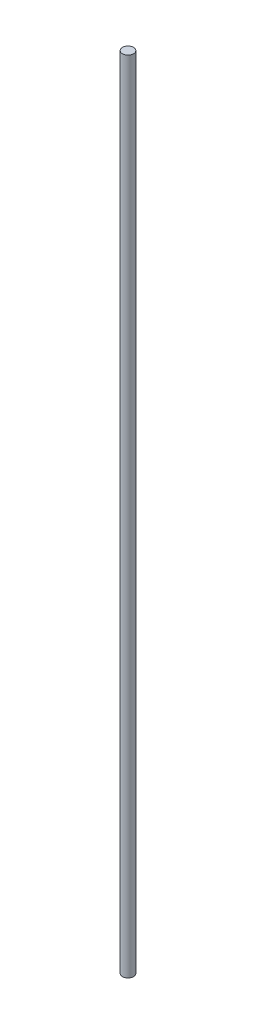
ISO-10303-21;
HEADER;
FILE_DESCRIPTION(('STEP AP214'),'2;1');
FILE_NAME('part.step','',(''),(''),'','','');
FILE_SCHEMA(('AUTOMOTIVE_DESIGN { 1 0 10303 214 1 1 1 1 }'));
ENDSEC;
DATA;
#1=APPLICATION_CONTEXT('core data for automotive mechanical design processes');
#2=APPLICATION_PROTOCOL_DEFINITION('international standard','automotive_design',2000,#1);
#3=PRODUCT_CONTEXT('',#1,'mechanical');
#4=PRODUCT('Part','Part','',(#3));
#5=PRODUCT_RELATED_PRODUCT_CATEGORY('part','',(#4));
#6=PRODUCT_DEFINITION_FORMATION('','',#4);
#7=PRODUCT_DEFINITION_CONTEXT('part definition',#1,'design');
#8=PRODUCT_DEFINITION('design','',#6,#7);
#9=PRODUCT_DEFINITION_SHAPE('','',#8);
#10=(LENGTH_UNIT() NAMED_UNIT(*) SI_UNIT(.MILLI.,.METRE.));
#11=(NAMED_UNIT(*) PLANE_ANGLE_UNIT() SI_UNIT($,.RADIAN.));
#12=(NAMED_UNIT(*) SI_UNIT($,.STERADIAN.) SOLID_ANGLE_UNIT());
#13=UNCERTAINTY_MEASURE_WITH_UNIT(LENGTH_MEASURE(1.E-05),#10,'distance_accuracy_value','');
#14=(GEOMETRIC_REPRESENTATION_CONTEXT(3) GLOBAL_UNCERTAINTY_ASSIGNED_CONTEXT((#13)) GLOBAL_UNIT_ASSIGNED_CONTEXT((#10,
#11,#12)) REPRESENTATION_CONTEXT('',''));
#15=CARTESIAN_POINT('',(0.,0.,0.));
#16=DIRECTION('',(0.,0.,1.));
#17=DIRECTION('',(1.,0.,0.));
#18=AXIS2_PLACEMENT_3D('',#15,#16,#17);
#19=CARTESIAN_POINT('',(0.,457.2,0.));
#20=DIRECTION('',(0.,-1.,0.));
#21=DIRECTION('',(0.,0.,-1.));
#22=AXIS2_PLACEMENT_3D('',#19,#20,#21);
#23=CYLINDRICAL_SURFACE('',#22,3.175);
#24=CARTESIAN_POINT('',(0.,457.2,0.));
#25=DIRECTION('',(0.,1.,0.));
#26=DIRECTION('',(0.,0.,1.));
#27=AXIS2_PLACEMENT_3D('',#24,#25,#26);
#28=CIRCLE('',#27,3.175);
#29=CARTESIAN_POINT('',(0.,457.2,3.175));
#30=VERTEX_POINT('',#29);
#31=EDGE_CURVE('E10',#30,#30,#28,.T.);
#32=ORIENTED_EDGE('',*,*,#31,.F.);
#33=EDGE_LOOP('',(#32));
#34=FACE_BOUND('',#33,.T.);
#35=CARTESIAN_POINT('',(0.,0.,0.));
#36=DIRECTION('',(0.,1.,0.));
#37=DIRECTION('',(0.,0.,1.));
#38=AXIS2_PLACEMENT_3D('',#35,#36,#37);
#39=CIRCLE('',#38,3.175);
#40=CARTESIAN_POINT('',(0.,0.,3.175));
#41=VERTEX_POINT('',#40);
#42=EDGE_CURVE('E38',#41,#41,#39,.T.);
#43=ORIENTED_EDGE('',*,*,#42,.T.);
#44=EDGE_LOOP('',(#43));
#45=FACE_BOUND('',#44,.T.);
#46=ADVANCED_FACE('F35',(#34,#45),#23,.T.);
#47=CARTESIAN_POINT('',(0.,457.2,0.));
#48=DIRECTION('',(0.,1.,0.));
#49=DIRECTION('',(0.,0.,1.));
#50=AXIS2_PLACEMENT_3D('',#47,#48,#49);
#51=PLANE('',#50);
#52=ORIENTED_EDGE('',*,*,#31,.T.);
#53=EDGE_LOOP('',(#52));
#54=FACE_BOUND('',#53,.T.);
#55=ADVANCED_FACE('F50',(#54),#51,.T.);
#56=CARTESIAN_POINT('',(0.,0.,0.));
#57=DIRECTION('',(0.,1.,0.));
#58=DIRECTION('',(0.,0.,1.));
#59=AXIS2_PLACEMENT_3D('',#56,#57,#58);
#60=PLANE('',#59);
#61=ORIENTED_EDGE('',*,*,#42,.F.);
#62=EDGE_LOOP('',(#61));
#63=FACE_BOUND('',#62,.T.);
#64=ADVANCED_FACE('F48',(#63),#60,.F.);
#65=CLOSED_SHELL('',(#46,#55,#64));
#66=MANIFOLD_SOLID_BREP('B2',#65);
#67=ADVANCED_BREP_SHAPE_REPRESENTATION('',(#18,#66),#14);
#68=SHAPE_DEFINITION_REPRESENTATION(#9,#67);
ENDSEC;
END-ISO-10303-21;
